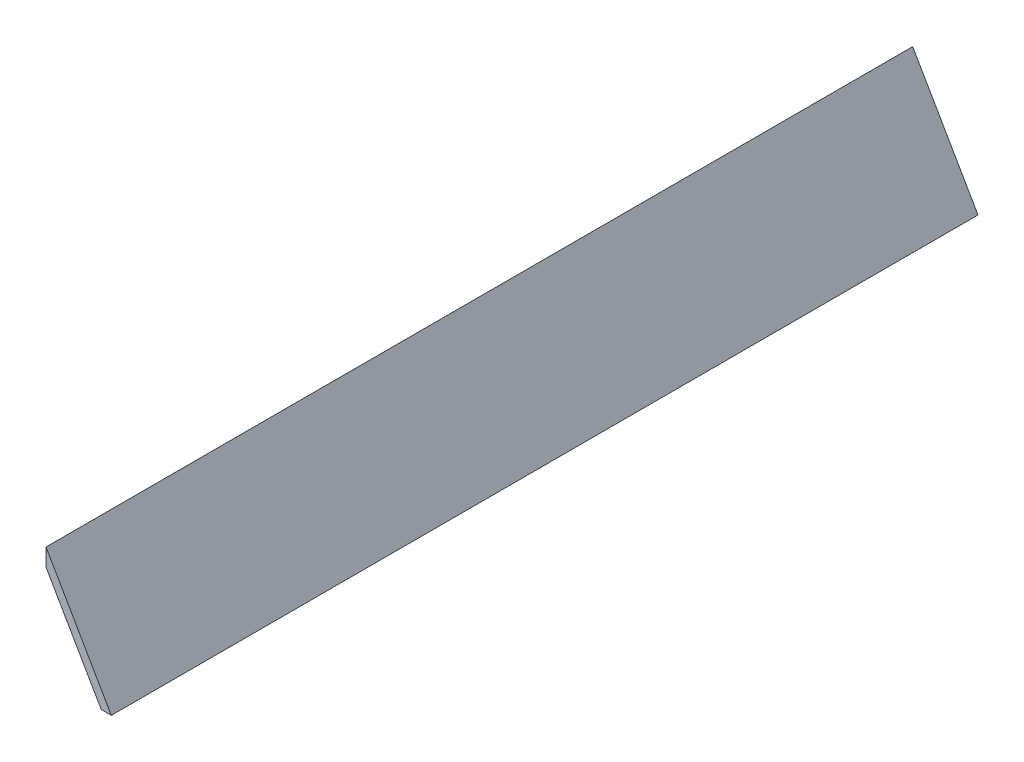
ISO-10303-21;
HEADER;
FILE_DESCRIPTION(('STEP AP214'),'2;1');
FILE_NAME('part.step','',(''),(''),'','','');
FILE_SCHEMA(('AUTOMOTIVE_DESIGN { 1 0 10303 214 1 1 1 1 }'));
ENDSEC;
DATA;
#1=APPLICATION_CONTEXT('core data for automotive mechanical design processes');
#2=APPLICATION_PROTOCOL_DEFINITION('international standard','automotive_design',2000,#1);
#3=PRODUCT_CONTEXT('',#1,'mechanical');
#4=PRODUCT('Part','Part','',(#3));
#5=PRODUCT_RELATED_PRODUCT_CATEGORY('part','',(#4));
#6=PRODUCT_DEFINITION_FORMATION('','',#4);
#7=PRODUCT_DEFINITION_CONTEXT('part definition',#1,'design');
#8=PRODUCT_DEFINITION('design','',#6,#7);
#9=PRODUCT_DEFINITION_SHAPE('','',#8);
#10=(LENGTH_UNIT() NAMED_UNIT(*) SI_UNIT(.MILLI.,.METRE.));
#11=(NAMED_UNIT(*) PLANE_ANGLE_UNIT() SI_UNIT($,.RADIAN.));
#12=(NAMED_UNIT(*) SI_UNIT($,.STERADIAN.) SOLID_ANGLE_UNIT());
#13=UNCERTAINTY_MEASURE_WITH_UNIT(LENGTH_MEASURE(1.E-05),#10,'distance_accuracy_value','');
#14=(GEOMETRIC_REPRESENTATION_CONTEXT(3) GLOBAL_UNCERTAINTY_ASSIGNED_CONTEXT((#13)) GLOBAL_UNIT_ASSIGNED_CONTEXT((#10,
#11,#12)) REPRESENTATION_CONTEXT('',''));
#15=CARTESIAN_POINT('',(0.,0.,0.));
#16=DIRECTION('',(0.,0.,1.));
#17=DIRECTION('',(1.,0.,0.));
#18=AXIS2_PLACEMENT_3D('',#15,#16,#17);
#19=CARTESIAN_POINT('',(4.34157201166264,85.00683104416,-99.5));
#20=DIRECTION('',(0.,-1.,0.));
#21=DIRECTION('',(0.,0.,-1.));
#22=AXIS2_PLACEMENT_3D('',#19,#20,#21);
#23=PLANE('',#22);
#24=DIRECTION('',(1.,0.,0.));
#25=VECTOR('',#24,1.);
#26=CARTESIAN_POINT('',(4.34157201166264,85.00683104416,0.));
#27=LINE('',#26,#25);
#28=CARTESIAN_POINT('',(4.34157201166264,85.00683104416,0.));
#29=VERTEX_POINT('',#28);
#30=CARTESIAN_POINT('',(5.49709443343771,85.00683104416,0.));
#31=VERTEX_POINT('',#30);
#32=EDGE_CURVE('E97',#29,#31,#27,.T.);
#33=ORIENTED_EDGE('',*,*,#32,.F.);
#34=DIRECTION('',(0.,0.,1.));
#35=VECTOR('',#34,1.);
#36=CARTESIAN_POINT('',(4.34157201166264,85.00683104416,-99.5));
#37=LINE('',#36,#35);
#38=CARTESIAN_POINT('',(4.34157201166264,85.00683104416,-99.5));
#39=VERTEX_POINT('',#38);
#40=EDGE_CURVE('E11',#39,#29,#37,.T.);
#41=ORIENTED_EDGE('',*,*,#40,.F.);
#42=DIRECTION('',(1.,0.,0.));
#43=VECTOR('',#42,1.);
#44=CARTESIAN_POINT('',(4.34157201166264,85.00683104416,-99.5));
#45=LINE('',#44,#43);
#46=CARTESIAN_POINT('',(5.49709443343771,85.00683104416,-99.5));
#47=VERTEX_POINT('',#46);
#48=EDGE_CURVE('E91',#39,#47,#45,.T.);
#49=ORIENTED_EDGE('',*,*,#48,.T.);
#50=DIRECTION('',(0.,0.,1.));
#51=VECTOR('',#50,1.);
#52=CARTESIAN_POINT('',(5.49709443343771,85.00683104416,-99.5));
#53=LINE('',#52,#51);
#54=EDGE_CURVE('E36',#47,#31,#53,.T.);
#55=ORIENTED_EDGE('',*,*,#54,.T.);
#56=EDGE_LOOP('',(#33,#41,#49,#55));
#57=FACE_BOUND('',#56,.T.);
#58=ADVANCED_FACE('F33',(#57),#23,.T.);
#59=CARTESIAN_POINT('',(-2.,95.9988891971987,-99.5));
#60=DIRECTION('',(-0.866185586038566,-0.499722453506971,0.));
#61=DIRECTION('',(0.499722453506971,-0.866185586038566,0.));
#62=AXIS2_PLACEMENT_3D('',#59,#60,#61);
#63=PLANE('',#62);
#64=DIRECTION('',(0.499722453506971,-0.866185586038566,0.));
#65=VECTOR('',#64,1.);
#66=CARTESIAN_POINT('',(-2.,95.9988891971987,0.));
#67=LINE('',#66,#65);
#68=CARTESIAN_POINT('',(-2.,95.9988891971987,0.));
#69=VERTEX_POINT('',#68);
#70=EDGE_CURVE('E93',#69,#29,#67,.T.);
#71=ORIENTED_EDGE('',*,*,#70,.F.);
#72=DIRECTION('',(0.,0.,1.));
#73=VECTOR('',#72,1.);
#74=CARTESIAN_POINT('',(-2.,95.9988891971987,-99.5));
#75=LINE('',#74,#73);
#76=CARTESIAN_POINT('',(-2.,95.9988891971987,-99.5));
#77=VERTEX_POINT('',#76);
#78=EDGE_CURVE('E42',#77,#69,#75,.T.);
#79=ORIENTED_EDGE('',*,*,#78,.F.);
#80=DIRECTION('',(0.499722453506971,-0.866185586038566,0.));
#81=VECTOR('',#80,1.);
#82=CARTESIAN_POINT('',(-2.,95.9988891971987,-99.5));
#83=LINE('',#82,#81);
#84=EDGE_CURVE('E88',#77,#39,#83,.T.);
#85=ORIENTED_EDGE('',*,*,#84,.T.);
#86=ORIENTED_EDGE('',*,*,#40,.T.);
#87=EDGE_LOOP('',(#71,#79,#85,#86));
#88=FACE_BOUND('',#87,.T.);
#89=ADVANCED_FACE('F107',(#88),#63,.T.);
#90=CARTESIAN_POINT('',(-2.,95.9988891971987,-99.5));
#91=DIRECTION('',(-1.,0.,0.));
#92=DIRECTION('',(0.,0.,1.));
#93=AXIS2_PLACEMENT_3D('',#90,#91,#92);
#94=PLANE('',#93);
#95=DIRECTION('',(0.,-1.,0.));
#96=VECTOR('',#95,1.);
#97=CARTESIAN_POINT('',(-2.,95.9988891971987,0.));
#98=LINE('',#97,#96);
#99=CARTESIAN_POINT('',(-2.,97.9988891973595,0.));
#100=VERTEX_POINT('',#99);
#101=EDGE_CURVE('E83',#100,#69,#98,.T.);
#102=ORIENTED_EDGE('',*,*,#101,.F.);
#103=DIRECTION('',(0.,0.,1.));
#104=VECTOR('',#103,1.);
#105=CARTESIAN_POINT('',(-2.,97.9988891973595,-99.5));
#106=LINE('',#105,#104);
#107=CARTESIAN_POINT('',(-2.,97.9988891973595,-99.5));
#108=VERTEX_POINT('',#107);
#109=EDGE_CURVE('E78',#108,#100,#106,.T.);
#110=ORIENTED_EDGE('',*,*,#109,.F.);
#111=DIRECTION('',(0.,-1.,0.));
#112=VECTOR('',#111,1.);
#113=CARTESIAN_POINT('',(-2.,95.9988891971987,-99.5));
#114=LINE('',#113,#112);
#115=EDGE_CURVE('E81',#108,#77,#114,.T.);
#116=ORIENTED_EDGE('',*,*,#115,.T.);
#117=ORIENTED_EDGE('',*,*,#78,.T.);
#118=EDGE_LOOP('',(#102,#110,#116,#117));
#119=FACE_BOUND('',#118,.T.);
#120=ADVANCED_FACE('F80',(#119),#94,.T.);
#121=CARTESIAN_POINT('',(-2.,97.9988891973595,-99.5));
#122=DIRECTION('',(0.866137210213299,0.499806295562514,0.));
#123=DIRECTION('',(-0.499806295562514,0.866137210213299,0.));
#124=AXIS2_PLACEMENT_3D('',#121,#122,#123);
#125=PLANE('',#124);
#126=DIRECTION('',(-0.499806295562514,0.866137210213299,0.));
#127=VECTOR('',#126,1.);
#128=CARTESIAN_POINT('',(-2.,97.9988891973595,0.));
#129=LINE('',#128,#127);
#130=EDGE_CURVE('E100',#31,#100,#129,.T.);
#131=ORIENTED_EDGE('',*,*,#130,.F.);
#132=ORIENTED_EDGE('',*,*,#54,.F.);
#133=DIRECTION('',(-0.499806295562514,0.866137210213299,0.));
#134=VECTOR('',#133,1.);
#135=CARTESIAN_POINT('',(-2.,97.9988891973595,-99.5));
#136=LINE('',#135,#134);
#137=EDGE_CURVE('E87',#47,#108,#136,.T.);
#138=ORIENTED_EDGE('',*,*,#137,.T.);
#139=ORIENTED_EDGE('',*,*,#109,.T.);
#140=EDGE_LOOP('',(#131,#132,#138,#139));
#141=FACE_BOUND('',#140,.T.);
#142=ADVANCED_FACE('F90',(#141),#125,.T.);
#143=CARTESIAN_POINT('',(0.,0.,-99.5));
#144=DIRECTION('',(0.,0.,1.));
#145=DIRECTION('',(1.,0.,0.));
#146=AXIS2_PLACEMENT_3D('',#143,#144,#145);
#147=PLANE('',#146);
#148=ORIENTED_EDGE('',*,*,#48,.F.);
#149=ORIENTED_EDGE('',*,*,#84,.F.);
#150=ORIENTED_EDGE('',*,*,#115,.F.);
#151=ORIENTED_EDGE('',*,*,#137,.F.);
#152=EDGE_LOOP('',(#148,#149,#150,#151));
#153=FACE_BOUND('',#152,.T.);
#154=ADVANCED_FACE('F86',(#153),#147,.F.);
#155=CARTESIAN_POINT('',(0.,0.,0.));
#156=DIRECTION('',(0.,0.,1.));
#157=DIRECTION('',(1.,0.,0.));
#158=AXIS2_PLACEMENT_3D('',#155,#156,#157);
#159=PLANE('',#158);
#160=ORIENTED_EDGE('',*,*,#32,.T.);
#161=ORIENTED_EDGE('',*,*,#130,.T.);
#162=ORIENTED_EDGE('',*,*,#101,.T.);
#163=ORIENTED_EDGE('',*,*,#70,.T.);
#164=EDGE_LOOP('',(#160,#161,#162,#163));
#165=FACE_BOUND('',#164,.T.);
#166=ADVANCED_FACE('F106',(#165),#159,.T.);
#167=CLOSED_SHELL('',(#58,#89,#120,#142,#154,#166));
#168=MANIFOLD_SOLID_BREP('B2',#167);
#169=ADVANCED_BREP_SHAPE_REPRESENTATION('',(#18,#168),#14);
#170=SHAPE_DEFINITION_REPRESENTATION(#9,#169);
ENDSEC;
END-ISO-10303-21;
